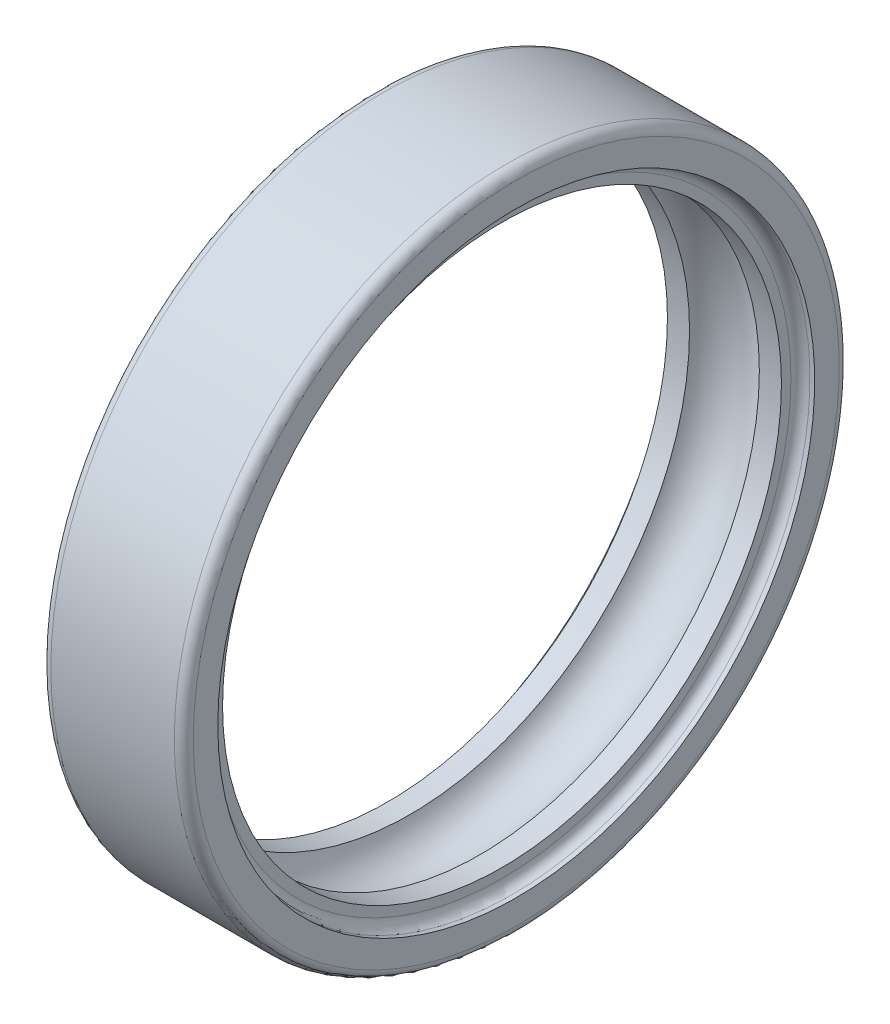
ISO-10303-21;
HEADER;
FILE_DESCRIPTION(('STEP AP214'),'2;1');
FILE_NAME('part.step','',(''),(''),'','','');
FILE_SCHEMA(('AUTOMOTIVE_DESIGN { 1 0 10303 214 1 1 1 1 }'));
ENDSEC;
DATA;
#1=APPLICATION_CONTEXT('core data for automotive mechanical design processes');
#2=APPLICATION_PROTOCOL_DEFINITION('international standard','automotive_design',2000,#1);
#3=PRODUCT_CONTEXT('',#1,'mechanical');
#4=PRODUCT('Part','Part','',(#3));
#5=PRODUCT_RELATED_PRODUCT_CATEGORY('part','',(#4));
#6=PRODUCT_DEFINITION_FORMATION('','',#4);
#7=PRODUCT_DEFINITION_CONTEXT('part definition',#1,'design');
#8=PRODUCT_DEFINITION('design','',#6,#7);
#9=PRODUCT_DEFINITION_SHAPE('','',#8);
#10=(LENGTH_UNIT() NAMED_UNIT(*) SI_UNIT(.MILLI.,.METRE.));
#11=(NAMED_UNIT(*) PLANE_ANGLE_UNIT() SI_UNIT($,.RADIAN.));
#12=(NAMED_UNIT(*) SI_UNIT($,.STERADIAN.) SOLID_ANGLE_UNIT());
#13=UNCERTAINTY_MEASURE_WITH_UNIT(LENGTH_MEASURE(1.E-05),#10,'distance_accuracy_value','');
#14=(GEOMETRIC_REPRESENTATION_CONTEXT(3) GLOBAL_UNCERTAINTY_ASSIGNED_CONTEXT((#13)) GLOBAL_UNIT_ASSIGNED_CONTEXT((#10,
#11,#12)) REPRESENTATION_CONTEXT('',''));
#15=CARTESIAN_POINT('',(0.,0.,0.));
#16=DIRECTION('',(0.,0.,1.));
#17=DIRECTION('',(1.,0.,0.));
#18=AXIS2_PLACEMENT_3D('',#15,#16,#17);
#19=CARTESIAN_POINT('',(0.599999999999877,0.,0.));
#20=DIRECTION('',(-1.,0.,0.));
#21=DIRECTION('',(0.,0.,1.));
#22=AXIS2_PLACEMENT_3D('',#19,#20,#21);
#23=TOROIDAL_SURFACE('',#22,20.4000000000001,0.599999999999876);
#24=CARTESIAN_POINT('',(0.,0.,0.));
#25=DIRECTION('',(-1.,0.,0.));
#26=DIRECTION('',(0.,0.,1.));
#27=AXIS2_PLACEMENT_3D('',#24,#25,#26);
#28=CIRCLE('',#27,20.4);
#29=CARTESIAN_POINT('',(0.,0.,20.4));
#30=VERTEX_POINT('',#29);
#31=EDGE_CURVE('E10',#30,#30,#28,.T.);
#32=ORIENTED_EDGE('',*,*,#31,.F.);
#33=EDGE_LOOP('',(#32));
#34=FACE_BOUND('',#33,.T.);
#35=CARTESIAN_POINT('',(0.600000000000003,0.,0.));
#36=DIRECTION('',(-1.,0.,0.));
#37=DIRECTION('',(0.,0.,1.));
#38=AXIS2_PLACEMENT_3D('',#35,#36,#37);
#39=CIRCLE('',#38,21.);
#40=CARTESIAN_POINT('',(0.600000000000003,0.,21.));
#41=VERTEX_POINT('',#40);
#42=EDGE_CURVE('E81',#41,#41,#39,.T.);
#43=ORIENTED_EDGE('',*,*,#42,.T.);
#44=EDGE_LOOP('',(#43));
#45=FACE_BOUND('',#44,.T.);
#46=ADVANCED_FACE('F35',(#34,#45),#23,.T.);
#47=CARTESIAN_POINT('',(0.,20.4,0.));
#48=DIRECTION('',(1.,0.,0.));
#49=DIRECTION('',(0.,0.,-1.));
#50=AXIS2_PLACEMENT_3D('',#47,#48,#49);
#51=PLANE('',#50);
#52=CARTESIAN_POINT('',(0.,0.,0.));
#53=DIRECTION('',(-1.,0.,0.));
#54=DIRECTION('',(0.,0.,1.));
#55=AXIS2_PLACEMENT_3D('',#52,#53,#54);
#56=CIRCLE('',#55,18.85);
#57=CARTESIAN_POINT('',(0.,0.,18.85));
#58=VERTEX_POINT('',#57);
#59=EDGE_CURVE('E41',#58,#58,#56,.T.);
#60=ORIENTED_EDGE('',*,*,#59,.F.);
#61=EDGE_LOOP('',(#60));
#62=FACE_BOUND('',#61,.T.);
#63=ORIENTED_EDGE('',*,*,#31,.T.);
#64=EDGE_LOOP('',(#63));
#65=FACE_BOUND('',#64,.T.);
#66=ADVANCED_FACE('F154',(#62,#65),#51,.F.);
#67=CARTESIAN_POINT('',(50.,0.,0.));
#68=DIRECTION('',(-1.,0.,0.));
#69=DIRECTION('',(0.,0.,1.));
#70=AXIS2_PLACEMENT_3D('',#67,#68,#69);
#71=CYLINDRICAL_SURFACE('',#70,18.85);
#72=CARTESIAN_POINT('',(0.300000000000002,0.,0.));
#73=DIRECTION('',(-1.,0.,0.));
#74=DIRECTION('',(0.,0.,1.));
#75=AXIS2_PLACEMENT_3D('',#72,#73,#74);
#76=CIRCLE('',#75,18.85);
#77=CARTESIAN_POINT('',(0.300000000000002,0.,18.85));
#78=VERTEX_POINT('',#77);
#79=EDGE_CURVE('E45',#78,#78,#76,.T.);
#80=ORIENTED_EDGE('',*,*,#79,.F.);
#81=EDGE_LOOP('',(#80));
#82=FACE_BOUND('',#81,.T.);
#83=ORIENTED_EDGE('',*,*,#59,.T.);
#84=EDGE_LOOP('',(#83));
#85=FACE_BOUND('',#84,.T.);
#86=ADVANCED_FACE('F149',(#82,#85),#71,.F.);
#87=CARTESIAN_POINT('',(0.300000000000129,0.,0.));
#88=DIRECTION('',(-1.,0.,0.));
#89=DIRECTION('',(0.,0.,1.));
#90=AXIS2_PLACEMENT_3D('',#87,#88,#89);
#91=TOROIDAL_SURFACE('',#90,18.2500000000001,0.599999999999871);
#92=CARTESIAN_POINT('',(0.899999999999998,0.,0.));
#93=DIRECTION('',(-1.,0.,0.));
#94=DIRECTION('',(0.,0.,1.));
#95=AXIS2_PLACEMENT_3D('',#92,#93,#94);
#96=CIRCLE('',#95,18.25);
#97=CARTESIAN_POINT('',(0.899999999999998,0.,18.25));
#98=VERTEX_POINT('',#97);
#99=EDGE_CURVE('E49',#98,#98,#96,.T.);
#100=ORIENTED_EDGE('',*,*,#99,.F.);
#101=EDGE_LOOP('',(#100));
#102=FACE_BOUND('',#101,.T.);
#103=ORIENTED_EDGE('',*,*,#79,.T.);
#104=EDGE_LOOP('',(#103));
#105=FACE_BOUND('',#104,.T.);
#106=ADVANCED_FACE('F143',(#102,#105),#91,.F.);
#107=CARTESIAN_POINT('',(0.9,18.25,0.));
#108=DIRECTION('',(1.,0.,0.));
#109=DIRECTION('',(0.,0.,-1.));
#110=AXIS2_PLACEMENT_3D('',#107,#108,#109);
#111=PLANE('',#110);
#112=CARTESIAN_POINT('',(0.899999999999998,0.,0.));
#113=DIRECTION('',(-1.,0.,0.));
#114=DIRECTION('',(0.,0.,1.));
#115=AXIS2_PLACEMENT_3D('',#112,#113,#114);
#116=CIRCLE('',#115,17.65);
#117=CARTESIAN_POINT('',(0.899999999999998,0.,17.65));
#118=VERTEX_POINT('',#117);
#119=EDGE_CURVE('E54',#118,#118,#116,.T.);
#120=ORIENTED_EDGE('',*,*,#119,.F.);
#121=EDGE_LOOP('',(#120));
#122=FACE_BOUND('',#121,.T.);
#123=ORIENTED_EDGE('',*,*,#99,.T.);
#124=EDGE_LOOP('',(#123));
#125=FACE_BOUND('',#124,.T.);
#126=ADVANCED_FACE('F137',(#122,#125),#111,.F.);
#127=CARTESIAN_POINT('',(50.,0.,0.));
#128=DIRECTION('',(-1.,0.,0.));
#129=DIRECTION('',(0.,0.,1.));
#130=AXIS2_PLACEMENT_3D('',#127,#128,#129);
#131=CYLINDRICAL_SURFACE('',#130,17.65);
#132=CARTESIAN_POINT('',(2.2956495287727,0.,0.));
#133=DIRECTION('',(-1.,0.,0.));
#134=DIRECTION('',(0.,0.,1.));
#135=AXIS2_PLACEMENT_3D('',#132,#133,#134);
#136=CIRCLE('',#135,17.65);
#137=CARTESIAN_POINT('',(2.2956495287727,0.,17.65));
#138=VERTEX_POINT('',#137);
#139=EDGE_CURVE('E57',#138,#138,#136,.T.);
#140=ORIENTED_EDGE('',*,*,#139,.F.);
#141=EDGE_LOOP('',(#140));
#142=FACE_BOUND('',#141,.T.);
#143=ORIENTED_EDGE('',*,*,#119,.T.);
#144=EDGE_LOOP('',(#143));
#145=FACE_BOUND('',#144,.T.);
#146=ADVANCED_FACE('F131',(#142,#145),#131,.F.);
#147=CARTESIAN_POINT('',(4.5,0.,0.));
#148=DIRECTION('',(-1.,0.,0.));
#149=DIRECTION('',(0.,0.,1.));
#150=AXIS2_PLACEMENT_3D('',#147,#148,#149);
#151=TOROIDAL_SURFACE('',#150,16.75,2.38100000000001);
#152=CARTESIAN_POINT('',(6.7043504712273,0.,0.));
#153=DIRECTION('',(-1.,0.,0.));
#154=DIRECTION('',(0.,0.,1.));
#155=AXIS2_PLACEMENT_3D('',#152,#153,#154);
#156=CIRCLE('',#155,17.65);
#157=CARTESIAN_POINT('',(6.7043504712273,0.,17.65));
#158=VERTEX_POINT('',#157);
#159=EDGE_CURVE('E60',#158,#158,#156,.T.);
#160=ORIENTED_EDGE('',*,*,#159,.F.);
#161=EDGE_LOOP('',(#160));
#162=FACE_BOUND('',#161,.T.);
#163=ORIENTED_EDGE('',*,*,#139,.T.);
#164=EDGE_LOOP('',(#163));
#165=FACE_BOUND('',#164,.T.);
#166=ADVANCED_FACE('F125',(#162,#165),#151,.F.);
#167=CARTESIAN_POINT('',(50.,0.,0.));
#168=DIRECTION('',(-1.,0.,0.));
#169=DIRECTION('',(0.,0.,1.));
#170=AXIS2_PLACEMENT_3D('',#167,#168,#169);
#171=CYLINDRICAL_SURFACE('',#170,17.65);
#172=CARTESIAN_POINT('',(8.1,0.,0.));
#173=DIRECTION('',(-1.,0.,0.));
#174=DIRECTION('',(0.,0.,1.));
#175=AXIS2_PLACEMENT_3D('',#172,#173,#174);
#176=CIRCLE('',#175,17.65);
#177=CARTESIAN_POINT('',(8.1,0.,17.65));
#178=VERTEX_POINT('',#177);
#179=EDGE_CURVE('E63',#178,#178,#176,.T.);
#180=ORIENTED_EDGE('',*,*,#179,.F.);
#181=EDGE_LOOP('',(#180));
#182=FACE_BOUND('',#181,.T.);
#183=ORIENTED_EDGE('',*,*,#159,.T.);
#184=EDGE_LOOP('',(#183));
#185=FACE_BOUND('',#184,.T.);
#186=ADVANCED_FACE('F119',(#182,#185),#171,.F.);
#187=CARTESIAN_POINT('',(8.1,17.65,0.));
#188=DIRECTION('',(-1.,0.,0.));
#189=DIRECTION('',(0.,0.,1.));
#190=AXIS2_PLACEMENT_3D('',#187,#188,#189);
#191=PLANE('',#190);
#192=CARTESIAN_POINT('',(8.1,0.,0.));
#193=DIRECTION('',(-1.,0.,0.));
#194=DIRECTION('',(0.,0.,1.));
#195=AXIS2_PLACEMENT_3D('',#192,#193,#194);
#196=CIRCLE('',#195,18.25);
#197=CARTESIAN_POINT('',(8.1,0.,18.25));
#198=VERTEX_POINT('',#197);
#199=EDGE_CURVE('E66',#198,#198,#196,.T.);
#200=ORIENTED_EDGE('',*,*,#199,.F.);
#201=EDGE_LOOP('',(#200));
#202=FACE_BOUND('',#201,.T.);
#203=ORIENTED_EDGE('',*,*,#179,.T.);
#204=EDGE_LOOP('',(#203));
#205=FACE_BOUND('',#204,.T.);
#206=ADVANCED_FACE('F113',(#202,#205),#191,.F.);
#207=CARTESIAN_POINT('',(8.69999999999992,0.,0.));
#208=DIRECTION('',(-1.,0.,0.));
#209=DIRECTION('',(0.,0.,1.));
#210=AXIS2_PLACEMENT_3D('',#207,#208,#209);
#211=TOROIDAL_SURFACE('',#210,18.2500000000001,0.599999999999923);
#212=CARTESIAN_POINT('',(8.7,0.,0.));
#213=DIRECTION('',(-1.,0.,0.));
#214=DIRECTION('',(0.,0.,1.));
#215=AXIS2_PLACEMENT_3D('',#212,#213,#214);
#216=CIRCLE('',#215,18.85);
#217=CARTESIAN_POINT('',(8.7,0.,18.85));
#218=VERTEX_POINT('',#217);
#219=EDGE_CURVE('E69',#218,#218,#216,.T.);
#220=ORIENTED_EDGE('',*,*,#219,.F.);
#221=EDGE_LOOP('',(#220));
#222=FACE_BOUND('',#221,.T.);
#223=ORIENTED_EDGE('',*,*,#199,.T.);
#224=EDGE_LOOP('',(#223));
#225=FACE_BOUND('',#224,.T.);
#226=ADVANCED_FACE('F107',(#222,#225),#211,.F.);
#227=CARTESIAN_POINT('',(50.,0.,0.));
#228=DIRECTION('',(-1.,0.,0.));
#229=DIRECTION('',(0.,0.,1.));
#230=AXIS2_PLACEMENT_3D('',#227,#228,#229);
#231=CYLINDRICAL_SURFACE('',#230,18.85);
#232=CARTESIAN_POINT('',(9.,0.,0.));
#233=DIRECTION('',(-1.,0.,0.));
#234=DIRECTION('',(0.,0.,1.));
#235=AXIS2_PLACEMENT_3D('',#232,#233,#234);
#236=CIRCLE('',#235,18.85);
#237=CARTESIAN_POINT('',(9.,0.,18.85));
#238=VERTEX_POINT('',#237);
#239=EDGE_CURVE('E72',#238,#238,#236,.T.);
#240=ORIENTED_EDGE('',*,*,#239,.F.);
#241=EDGE_LOOP('',(#240));
#242=FACE_BOUND('',#241,.T.);
#243=ORIENTED_EDGE('',*,*,#219,.T.);
#244=EDGE_LOOP('',(#243));
#245=FACE_BOUND('',#244,.T.);
#246=ADVANCED_FACE('F101',(#242,#245),#231,.F.);
#247=CARTESIAN_POINT('',(9.,18.85,0.));
#248=DIRECTION('',(-1.,0.,0.));
#249=DIRECTION('',(0.,0.,1.));
#250=AXIS2_PLACEMENT_3D('',#247,#248,#249);
#251=PLANE('',#250);
#252=CARTESIAN_POINT('',(9.,0.,0.));
#253=DIRECTION('',(-1.,0.,0.));
#254=DIRECTION('',(0.,0.,1.));
#255=AXIS2_PLACEMENT_3D('',#252,#253,#254);
#256=CIRCLE('',#255,20.4);
#257=CARTESIAN_POINT('',(9.,0.,20.4));
#258=VERTEX_POINT('',#257);
#259=EDGE_CURVE('E75',#258,#258,#256,.T.);
#260=ORIENTED_EDGE('',*,*,#259,.F.);
#261=EDGE_LOOP('',(#260));
#262=FACE_BOUND('',#261,.T.);
#263=ORIENTED_EDGE('',*,*,#239,.T.);
#264=EDGE_LOOP('',(#263));
#265=FACE_BOUND('',#264,.T.);
#266=ADVANCED_FACE('F95',(#262,#265),#251,.F.);
#267=CARTESIAN_POINT('',(8.40000000000007,0.,0.));
#268=DIRECTION('',(-1.,0.,0.));
#269=DIRECTION('',(0.,0.,1.));
#270=AXIS2_PLACEMENT_3D('',#267,#268,#269);
#271=TOROIDAL_SURFACE('',#270,20.4000000000001,0.599999999999924);
#272=CARTESIAN_POINT('',(8.4,0.,0.));
#273=DIRECTION('',(-1.,0.,0.));
#274=DIRECTION('',(0.,0.,1.));
#275=AXIS2_PLACEMENT_3D('',#272,#273,#274);
#276=CIRCLE('',#275,21.);
#277=CARTESIAN_POINT('',(8.4,0.,21.));
#278=VERTEX_POINT('',#277);
#279=EDGE_CURVE('E78',#278,#278,#276,.T.);
#280=ORIENTED_EDGE('',*,*,#279,.F.);
#281=EDGE_LOOP('',(#280));
#282=FACE_BOUND('',#281,.T.);
#283=ORIENTED_EDGE('',*,*,#259,.T.);
#284=EDGE_LOOP('',(#283));
#285=FACE_BOUND('',#284,.T.);
#286=ADVANCED_FACE('F89',(#282,#285),#271,.T.);
#287=CARTESIAN_POINT('',(50.,0.,0.));
#288=DIRECTION('',(-1.,0.,0.));
#289=DIRECTION('',(0.,0.,1.));
#290=AXIS2_PLACEMENT_3D('',#287,#288,#289);
#291=CYLINDRICAL_SURFACE('',#290,21.);
#292=ORIENTED_EDGE('',*,*,#42,.F.);
#293=EDGE_LOOP('',(#292));
#294=FACE_BOUND('',#293,.T.);
#295=ORIENTED_EDGE('',*,*,#279,.T.);
#296=EDGE_LOOP('',(#295));
#297=FACE_BOUND('',#296,.T.);
#298=ADVANCED_FACE('F86',(#294,#297),#291,.T.);
#299=CLOSED_SHELL('',(#46,#66,#86,#106,#126,#146,#166,#186,#206,#226,#246,#266,#286,#298));
#300=MANIFOLD_SOLID_BREP('B2',#299);
#301=ADVANCED_BREP_SHAPE_REPRESENTATION('',(#18,#300),#14);
#302=SHAPE_DEFINITION_REPRESENTATION(#9,#301);
ENDSEC;
END-ISO-10303-21;
